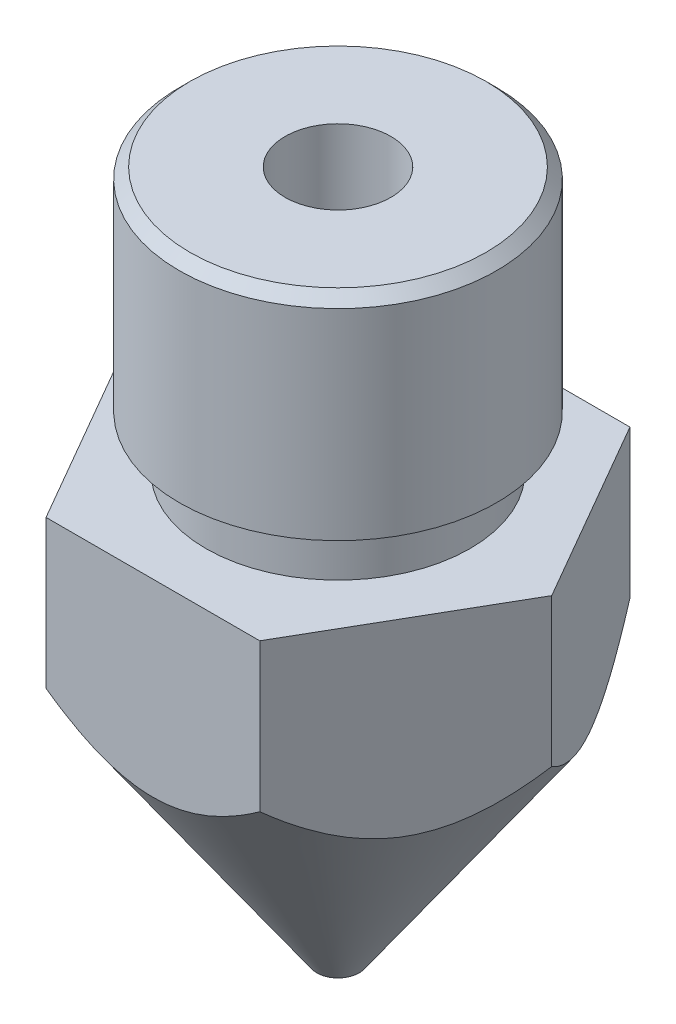
ISO-10303-21;
HEADER;
FILE_DESCRIPTION(('STEP AP214'),'2;1');
FILE_NAME('part.step','',(''),(''),'','','');
FILE_SCHEMA(('AUTOMOTIVE_DESIGN { 1 0 10303 214 1 1 1 1 }'));
ENDSEC;
DATA;
#1=APPLICATION_CONTEXT('core data for automotive mechanical design processes');
#2=APPLICATION_PROTOCOL_DEFINITION('international standard','automotive_design',2000,#1);
#3=PRODUCT_CONTEXT('',#1,'mechanical');
#4=PRODUCT('Part','Part','',(#3));
#5=PRODUCT_RELATED_PRODUCT_CATEGORY('part','',(#4));
#6=PRODUCT_DEFINITION_FORMATION('','',#4);
#7=PRODUCT_DEFINITION_CONTEXT('part definition',#1,'design');
#8=PRODUCT_DEFINITION('design','',#6,#7);
#9=PRODUCT_DEFINITION_SHAPE('','',#8);
#10=(LENGTH_UNIT() NAMED_UNIT(*) SI_UNIT(.MILLI.,.METRE.));
#11=(NAMED_UNIT(*) PLANE_ANGLE_UNIT() SI_UNIT($,.RADIAN.));
#12=(NAMED_UNIT(*) SI_UNIT($,.STERADIAN.) SOLID_ANGLE_UNIT());
#13=UNCERTAINTY_MEASURE_WITH_UNIT(LENGTH_MEASURE(1.E-05),#10,'distance_accuracy_value','');
#14=(GEOMETRIC_REPRESENTATION_CONTEXT(3) GLOBAL_UNCERTAINTY_ASSIGNED_CONTEXT((#13)) GLOBAL_UNIT_ASSIGNED_CONTEXT((#10,
#11,#12)) REPRESENTATION_CONTEXT('',''));
#15=CARTESIAN_POINT('',(0.,0.,0.));
#16=DIRECTION('',(0.,0.,1.));
#17=DIRECTION('',(1.,0.,0.));
#18=AXIS2_PLACEMENT_3D('',#15,#16,#17);
#19=CARTESIAN_POINT('',(0.,13.,0.));
#20=DIRECTION('',(0.,-1.,0.));
#21=DIRECTION('',(0.,0.,-1.));
#22=AXIS2_PLACEMENT_3D('',#19,#20,#21);
#23=CYLINDRICAL_SURFACE('',#22,0.2);
#24=CARTESIAN_POINT('',(0.,0.,0.));
#25=DIRECTION('',(0.,1.,0.));
#26=DIRECTION('',(0.,0.,1.));
#27=AXIS2_PLACEMENT_3D('',#24,#25,#26);
#28=CIRCLE('',#27,0.2);
#29=CARTESIAN_POINT('',(0.,0.,0.2));
#30=VERTEX_POINT('',#29);
#31=EDGE_CURVE('E350',#30,#30,#28,.T.);
#32=ORIENTED_EDGE('',*,*,#31,.F.);
#33=EDGE_LOOP('',(#32));
#34=FACE_BOUND('',#33,.T.);
#35=CARTESIAN_POINT('',(0.,3.,0.));
#36=DIRECTION('',(0.,1.,0.));
#37=DIRECTION('',(0.,0.,1.));
#38=AXIS2_PLACEMENT_3D('',#35,#36,#37);
#39=CIRCLE('',#38,0.2);
#40=CARTESIAN_POINT('',(0.,3.,0.2));
#41=VERTEX_POINT('',#40);
#42=EDGE_CURVE('E97',#41,#41,#39,.T.);
#43=ORIENTED_EDGE('',*,*,#42,.T.);
#44=EDGE_LOOP('',(#43));
#45=FACE_BOUND('',#44,.T.);
#46=ADVANCED_FACE('F17',(#34,#45),#23,.F.);
#47=CARTESIAN_POINT('',(0.,0.,0.));
#48=DIRECTION('',(0.,1.,0.));
#49=DIRECTION('',(0.,0.,1.));
#50=AXIS2_PLACEMENT_3D('',#47,#48,#49);
#51=PLANE('',#50);
#52=ORIENTED_EDGE('',*,*,#31,.T.);
#53=EDGE_LOOP('',(#52));
#54=FACE_BOUND('',#53,.T.);
#55=CARTESIAN_POINT('',(0.,0.,0.));
#56=DIRECTION('',(0.,1.,0.));
#57=DIRECTION('',(0.,0.,1.));
#58=AXIS2_PLACEMENT_3D('',#55,#56,#57);
#59=CIRCLE('',#58,0.4);
#60=CARTESIAN_POINT('',(0.,0.,0.4));
#61=VERTEX_POINT('',#60);
#62=EDGE_CURVE('E155',#61,#61,#59,.T.);
#63=ORIENTED_EDGE('',*,*,#62,.F.);
#64=EDGE_LOOP('',(#63));
#65=FACE_BOUND('',#64,.T.);
#66=ADVANCED_FACE('F120',(#54,#65),#51,.F.);
#67=CARTESIAN_POINT('',(0.,13.,0.));
#68=DIRECTION('',(0.,1.,0.));
#69=DIRECTION('',(0.,0.,1.));
#70=AXIS2_PLACEMENT_3D('',#67,#68,#69);
#71=PLANE('',#70);
#72=CARTESIAN_POINT('',(0.,13.,0.));
#73=DIRECTION('',(0.,1.,0.));
#74=DIRECTION('',(0.,0.,1.));
#75=AXIS2_PLACEMENT_3D('',#72,#73,#74);
#76=CIRCLE('',#75,2.8);
#77=CARTESIAN_POINT('',(0.,13.,2.8));
#78=VERTEX_POINT('',#77);
#79=EDGE_CURVE('E25',#78,#78,#76,.T.);
#80=ORIENTED_EDGE('',*,*,#79,.T.);
#81=EDGE_LOOP('',(#80));
#82=FACE_BOUND('',#81,.T.);
#83=CARTESIAN_POINT('',(0.,13.,0.));
#84=DIRECTION('',(0.,1.,0.));
#85=DIRECTION('',(0.,0.,1.));
#86=AXIS2_PLACEMENT_3D('',#83,#84,#85);
#87=CIRCLE('',#86,1.);
#88=CARTESIAN_POINT('',(0.,13.,1.));
#89=VERTEX_POINT('',#88);
#90=EDGE_CURVE('E327',#89,#89,#87,.T.);
#91=ORIENTED_EDGE('',*,*,#90,.F.);
#92=EDGE_LOOP('',(#91));
#93=FACE_BOUND('',#92,.T.);
#94=ADVANCED_FACE('F104',(#82,#93),#71,.T.);
#95=CARTESIAN_POINT('',(-2.02072594216369,13.,3.5));
#96=DIRECTION('',(0.,0.,-1.));
#97=DIRECTION('',(-1.,0.,0.));
#98=AXIS2_PLACEMENT_3D('',#95,#96,#97);
#99=PLANE('',#98);
#100=DIRECTION('',(0.,-1.,0.));
#101=VECTOR('',#100,1.);
#102=CARTESIAN_POINT('',(-2.02072594216369,13.,3.5));
#103=LINE('',#102,#101);
#104=CARTESIAN_POINT('',(-2.02072594216369,8.,3.5));
#105=VERTEX_POINT('',#104);
#106=CARTESIAN_POINT('',(-2.02072594216369,5.20053225024948,3.5));
#107=VERTEX_POINT('',#106);
#108=EDGE_CURVE('E84',#105,#107,#103,.T.);
#109=ORIENTED_EDGE('',*,*,#108,.T.);
#110=CARTESIAN_POINT('',(-6.56596910646884,10.0549633804167,3.5));
#111=CARTESIAN_POINT('',(-6.43866348835633,9.89453962518679,3.5));
#112=CARTESIAN_POINT('',(-6.31086954396274,9.73450070008599,3.5));
#113=CARTESIAN_POINT('',(-6.05409276696249,9.41536565444267,3.5));
#114=CARTESIAN_POINT('',(-5.92510987045232,9.25626958534052,3.5));
#115=CARTESIAN_POINT('',(-5.66547900136359,8.93887132675882,3.5));
#116=CARTESIAN_POINT('',(-5.53482805479293,8.78057156665934,3.5));
#117=CARTESIAN_POINT('',(-5.27186154894576,8.46536466022269,3.5));
#118=CARTESIAN_POINT('',(-5.13954602447201,8.30845748488617,3.5));
#119=CARTESIAN_POINT('',(-4.86574346116799,7.98798031222638,3.5));
#120=CARTESIAN_POINT('',(-4.72414544105982,7.82450493657504,3.5));
#121=CARTESIAN_POINT('',(-4.43819008048607,7.49998717532655,3.5));
#122=CARTESIAN_POINT('',(-4.29383281900571,7.33894472032093,3.5));
#123=CARTESIAN_POINT('',(-4.0017874337075,7.02018160230974,3.5));
#124=CARTESIAN_POINT('',(-3.85410263122494,6.86245790659457,3.5));
#125=CARTESIAN_POINT('',(-3.55432878461169,6.55126810131702,3.5));
#126=CARTESIAN_POINT('',(-3.40224034356932,6.39780141433167,3.5));
#127=CARTESIAN_POINT('',(-3.10578445457138,6.10983858775095,3.5));
#128=CARTESIAN_POINT('',(-2.96189499568121,5.97485300551214,3.5));
#129=CARTESIAN_POINT('',(-2.6677954071575,5.71161257481566,3.5));
#130=CARTESIAN_POINT('',(-2.51758001783785,5.58336353478699,3.5));
#131=CARTESIAN_POINT('',(-2.21109202426049,5.33840520958888,3.5));
#132=CARTESIAN_POINT('',(-2.05492185806982,5.22156898262048,3.5));
#133=CARTESIAN_POINT('',(-1.73270553161752,5.00258209791958,3.5));
#134=CARTESIAN_POINT('',(-1.5666795586152,4.90040279296644,3.5));
#135=CARTESIAN_POINT('',(-1.3279274138916,4.77421025496878,3.5));
#136=CARTESIAN_POINT('',(-1.26026441374337,4.74062090891803,3.5));
#137=CARTESIAN_POINT('',(-1.12293569698546,4.67739888568899,3.5));
#138=CARTESIAN_POINT('',(-1.05326564168055,4.64777570678828,3.5));
#139=CARTESIAN_POINT('',(-0.841572677756138,4.56608459440827,3.5));
#140=CARTESIAN_POINT('',(-0.696628461837466,4.52106394199791,3.5));
#141=CARTESIAN_POINT('',(-0.475301212797295,4.47205959319694,3.5));
#142=CARTESIAN_POINT('',(-0.400903000256181,4.45881411856813,3.5));
#143=CARTESIAN_POINT('',(-0.251205631776353,4.43898936574924,3.5));
#144=CARTESIAN_POINT('',(-0.175906566974466,4.4324094189001,3.5));
#145=CARTESIAN_POINT('',(-0.0246190434143277,4.42620926101708,3.5));
#146=CARTESIAN_POINT('',(0.0513709492970929,4.42662641560355,3.5));
#147=CARTESIAN_POINT('',(0.202983586239781,4.43448874857977,3.5));
#148=CARTESIAN_POINT('',(0.278606224046414,4.44193404944248,3.5));
#149=CARTESIAN_POINT('',(0.428918679303305,4.46351945444624,3.5));
#150=CARTESIAN_POINT('',(0.50360799635732,4.47766300401777,3.5));
#151=CARTESIAN_POINT('',(0.651572993314093,4.51206754550917,3.5));
#152=CARTESIAN_POINT('',(0.724848137084865,4.53233081084094,3.5));
#153=CARTESIAN_POINT('',(0.899910572260747,4.58785982680219,3.5));
#154=CARTESIAN_POINT('',(1.00083155428562,4.62585722937402,3.5));
#155=CARTESIAN_POINT('',(1.19889703425961,4.71065059278271,3.5));
#156=CARTESIAN_POINT('',(1.29603931599594,4.75745162579236,3.5));
#157=CARTESIAN_POINT('',(1.48766889879038,4.85854772483481,3.5));
#158=CARTESIAN_POINT('',(1.58211541869994,4.91291932213962,3.5));
#159=CARTESIAN_POINT('',(1.76750510936477,5.02720775539733,3.5));
#160=CARTESIAN_POINT('',(1.85844957926209,5.08712250640795,3.5));
#161=CARTESIAN_POINT('',(2.10621528063438,5.25917492957498,3.5));
#162=CARTESIAN_POINT('',(2.25979053449236,5.37597373885655,3.5));
#163=CARTESIAN_POINT('',(2.5595552007265,5.61875738389579,3.5));
#164=CARTESIAN_POINT('',(2.70573836700778,5.74474977541786,3.5));
#165=CARTESIAN_POINT('',(2.99288775316325,6.00364378251752,3.5));
#166=CARTESIAN_POINT('',(3.13383051576655,6.13657125023384,3.5));
#167=CARTESIAN_POINT('',(3.4111078237866,6.40702622585031,3.5));
#168=CARTESIAN_POINT('',(3.54744387912505,6.54455219652818,3.5));
#169=CARTESIAN_POINT('',(3.80573929247713,6.8119199283571,3.5));
#170=CARTESIAN_POINT('',(3.92797568886549,6.94149520815316,3.5));
#171=CARTESIAN_POINT('',(4.16997118326267,7.20295786967185,3.5));
#172=CARTESIAN_POINT('',(4.28973002730461,7.33484548589054,3.5));
#173=CARTESIAN_POINT('',(4.52611286600037,7.59923711362082,3.5));
#174=CARTESIAN_POINT('',(4.64275549839927,7.73172450594585,3.5));
#175=CARTESIAN_POINT('',(4.87431906433878,7.99814619089946,3.5));
#176=CARTESIAN_POINT('',(4.98924036633033,8.1320801630105,3.5));
#177=CARTESIAN_POINT('',(5.10347219829327,8.2665919853118,3.5));
#178=B_SPLINE_CURVE_WITH_KNOTS('',3,(#110,#111,#112,#113,#114,#115,#116,#117,#118,#119,#120,
#121,#122,#123,#124,#125,#126,#127,#128,#129,#130,#131,#132,#133,#134,#135,#136,#137,#138,#139,
#140,#141,#142,#143,#144,#145,#146,#147,#148,#149,#150,#151,#152,#153,#154,#155,#156,#157,#158,
#159,#160,#161,#162,#163,#164,#165,#166,#167,#168,#169,#170,#171,#172,#173,#174,#175,#176,#177),
.UNSPECIFIED.,.F.,.F.,(4,2,2,2,2,2,2,2,2,2,2,2,2,2,2,2,2,2,2,2,2,2,2,2,2,2,2,2,2,2,2,2,2,4),(0.,
0.614398243487174,1.22882970431128,1.84457683213854,2.46031110734161,3.10910690210451,
3.7578841523675,4.40604025471555,5.05410800660047,5.64584375433319,6.23808160840172,
6.82272121754572,7.40620209593753,7.63270621528486,7.85974342348608,8.31300645411389,
8.53946388358706,8.76589859350709,8.99354288350258,9.2211911405164,9.44895662213539,
9.67680682060112,9.99976924042732,10.3229183067251,10.6496100103214,10.9761793313348,
11.5544274481323,12.1331562713057,12.7142226943707,13.2950967788323,13.8294582971451,
14.3638743226156,14.893411526499,15.4228337146921),.UNSPECIFIED.);
#179=CARTESIAN_POINT('',(2.02072594216369,5.20053225024948,3.5));
#180=VERTEX_POINT('',#179);
#181=EDGE_CURVE('E32',#107,#180,#178,.T.);
#182=ORIENTED_EDGE('',*,*,#181,.T.);
#183=DIRECTION('',(0.,-1.,0.));
#184=VECTOR('',#183,1.);
#185=CARTESIAN_POINT('',(2.02072594216369,13.,3.5));
#186=LINE('',#185,#184);
#187=CARTESIAN_POINT('',(2.02072594216369,8.,3.5));
#188=VERTEX_POINT('',#187);
#189=EDGE_CURVE('E82',#188,#180,#186,.T.);
#190=ORIENTED_EDGE('',*,*,#189,.F.);
#191=DIRECTION('',(1.,0.,0.));
#192=VECTOR('',#191,1.);
#193=CARTESIAN_POINT('',(-2.02072594216369,8.,3.5));
#194=LINE('',#193,#192);
#195=EDGE_CURVE('E348',#105,#188,#194,.T.);
#196=ORIENTED_EDGE('',*,*,#195,.F.);
#197=EDGE_LOOP('',(#109,#182,#190,#196));
#198=FACE_BOUND('',#197,.T.);
#199=ADVANCED_FACE('F80',(#198),#99,.F.);
#200=CARTESIAN_POINT('',(2.02072594216369,13.,3.5));
#201=DIRECTION('',(-0.866025403784439,0.,-0.5));
#202=DIRECTION('',(-0.5,0.,0.866025403784439));
#203=AXIS2_PLACEMENT_3D('',#200,#201,#202);
#204=PLANE('',#203);
#205=ORIENTED_EDGE('',*,*,#189,.T.);
#206=CARTESIAN_POINT('',(2.02061047210985,5.20069716564401,3.5002));
#207=CARTESIAN_POINT('',(2.06406838572698,5.13868025552019,3.42492868562419));
#208=CARTESIAN_POINT('',(2.10823987084125,5.0785455200821,3.3484214291605));
#209=CARTESIAN_POINT('',(2.19834562157991,4.96311473302967,3.19235369082702));
#210=CARTESIAN_POINT('',(2.24428547173839,4.90783619410095,3.11278353626043));
#211=CARTESIAN_POINT('',(2.33895624375182,4.80253724523297,2.94880894914139));
#212=CARTESIAN_POINT('',(2.38772566583267,4.75265294242402,2.8643378322416));
#213=CARTESIAN_POINT('',(2.4871463568685,4.66142015009843,2.69213614404392));
#214=CARTESIAN_POINT('',(2.53779497704014,4.62006014719537,2.60441016057338));
#215=CARTESIAN_POINT('',(2.65984804457325,4.53479696433546,2.39300804638639));
#216=CARTESIAN_POINT('',(2.73209808660208,4.49544602753924,2.26786730274347));
#217=CARTESIAN_POINT('',(2.84180281093778,4.45535029902395,2.07785314636371));
#218=CARTESIAN_POINT('',(2.87842540048824,4.44514423835387,2.01442096055756));
#219=CARTESIAN_POINT('',(2.95198686309838,4.43126753264004,1.88700876983773));
#220=CARTESIAN_POINT('',(2.98892571455519,4.42759644473539,1.8230288023413));
#221=CARTESIAN_POINT('',(3.06291739961066,4.42696477219661,1.69487144448759));
#222=CARTESIAN_POINT('',(3.09997026868219,4.43002256499131,1.63069399268951));
#223=CARTESIAN_POINT('',(3.17379060458512,4.44274540459667,1.50283342027383));
#224=CARTESIAN_POINT('',(3.21055805134491,4.45241091189679,1.43915033442128));
#225=CARTESIAN_POINT('',(3.28389426216459,4.47806538927384,1.31212829124702));
#226=CARTESIAN_POINT('',(3.32045776133193,4.49411396352336,1.24879845298668));
#227=CARTESIAN_POINT('',(3.39284290342095,4.53192623843443,1.1234237091754));
#228=CARTESIAN_POINT('',(3.42866426335177,4.55369207743913,1.061379293779));
#229=CARTESIAN_POINT('',(3.51648921435228,4.61393890843105,0.909262016473883));
#230=CARTESIAN_POINT('',(3.5679783361557,4.65542170200923,0.820080241473256));
#231=CARTESIAN_POINT('',(3.66899632136438,4.74722764353229,0.645111958613582));
#232=CARTESIAN_POINT('',(3.718522234799,4.79756352004559,0.559330560253556));
#233=CARTESIAN_POINT('',(3.81463985277904,4.90398950830515,0.392849962409646));
#234=CARTESIAN_POINT('',(3.86127111180267,4.95993860361706,0.312082252559815));
#235=CARTESIAN_POINT('',(3.95269929229769,5.07685974888591,0.153723998698863));
#236=CARTESIAN_POINT('',(3.9975022958959,5.13781269044058,0.0761229201350578));
#237=CARTESIAN_POINT('',(4.04156735438121,5.20069716564401,-0.000200000000000459));
#238=B_SPLINE_CURVE_WITH_KNOTS('',3,(#206,#207,#208,#209,#210,#211,#212,#213,#214,#215,#216,
#217,#218,#219,#220,#221,#222,#223,#224,#225,#226,#227,#228,#229,#230,#231,#232,#233,#234,#235,
#236,#237),.UNSPECIFIED.,.F.,.F.,(4,2,2,2,2,2,2,2,2,2,2,2,2,2,2,4),(0.,0.320393122670371,
0.641897910507141,0.970209733955276,1.29807517267262,1.74525894539722,1.96687074712546,
2.18846753013118,2.41067027306681,2.63288850281819,2.85723241431995,3.08166035359645,
3.41416638316358,3.74715444245788,4.07323540634794,4.39812441959192),.UNSPECIFIED.);
#239=CARTESIAN_POINT('',(4.04145188432738,5.20053225024948,0.));
#240=VERTEX_POINT('',#239);
#241=EDGE_CURVE('E68',#180,#240,#238,.T.);
#242=ORIENTED_EDGE('',*,*,#241,.T.);
#243=DIRECTION('',(0.,-1.,0.));
#244=VECTOR('',#243,1.);
#245=CARTESIAN_POINT('',(4.04145188432738,13.,0.));
#246=LINE('',#245,#244);
#247=CARTESIAN_POINT('',(4.04145188432738,8.,0.));
#248=VERTEX_POINT('',#247);
#249=EDGE_CURVE('E90',#248,#240,#246,.T.);
#250=ORIENTED_EDGE('',*,*,#249,.F.);
#251=DIRECTION('',(0.5,0.,-0.866025403784439));
#252=VECTOR('',#251,1.);
#253=CARTESIAN_POINT('',(2.02072594216369,8.,3.5));
#254=LINE('',#253,#252);
#255=EDGE_CURVE('E88',#188,#248,#254,.T.);
#256=ORIENTED_EDGE('',*,*,#255,.F.);
#257=EDGE_LOOP('',(#205,#242,#250,#256));
#258=FACE_BOUND('',#257,.T.);
#259=ADVANCED_FACE('F87',(#258),#204,.F.);
#260=CARTESIAN_POINT('',(2.02072594216369,13.,-3.5));
#261=DIRECTION('',(-0.866025403784439,0.,0.5));
#262=DIRECTION('',(0.5,0.,0.866025403784439));
#263=AXIS2_PLACEMENT_3D('',#260,#261,#262);
#264=PLANE('',#263);
#265=ORIENTED_EDGE('',*,*,#249,.T.);
#266=CARTESIAN_POINT('',(4.04156735438121,5.20069716564401,0.0002));
#267=CARTESIAN_POINT('',(3.99810944076409,5.13868025552019,-0.0750713143758071));
#268=CARTESIAN_POINT('',(3.95393795564981,5.0785455200821,-0.151578570839502));
#269=CARTESIAN_POINT('',(3.86383220491116,4.96311473302966,-0.307646309172986));
#270=CARTESIAN_POINT('',(3.81789235475268,4.90783619410094,-0.387216463739575));
#271=CARTESIAN_POINT('',(3.72322158273924,4.80253724523297,-0.551191050858616));
#272=CARTESIAN_POINT('',(3.6744521606584,4.75265294242402,-0.635662167758408));
#273=CARTESIAN_POINT('',(3.57503146962256,4.66142015009843,-0.807863855956087));
#274=CARTESIAN_POINT('',(3.52438284945093,4.62006014719537,-0.895589839426615));
#275=CARTESIAN_POINT('',(3.40232978191782,4.53479696433545,-1.1069919536136));
#276=CARTESIAN_POINT('',(3.33007973988899,4.49544602753924,-1.23213269725653));
#277=CARTESIAN_POINT('',(3.22037501555329,4.45535029902395,-1.42214685363629));
#278=CARTESIAN_POINT('',(3.18375242600282,4.44514423835387,-1.48557903944243));
#279=CARTESIAN_POINT('',(3.11019096339269,4.43126753264004,-1.61299123016227));
#280=CARTESIAN_POINT('',(3.07325211193588,4.42759644473539,-1.6769711976587));
#281=CARTESIAN_POINT('',(2.99926042688041,4.42696477219661,-1.80512855551241));
#282=CARTESIAN_POINT('',(2.96220755780888,4.43002256499131,-1.86930600731049));
#283=CARTESIAN_POINT('',(2.88838722190595,4.44274540459667,-1.99716657972617));
#284=CARTESIAN_POINT('',(2.85161977514615,4.45241091189679,-2.06084966557872));
#285=CARTESIAN_POINT('',(2.77828356432648,4.47806538927384,-2.18787170875298));
#286=CARTESIAN_POINT('',(2.74172006515913,4.49411396352336,-2.25120154701332));
#287=CARTESIAN_POINT('',(2.66933492307011,4.53192623843443,-2.3765762908246));
#288=CARTESIAN_POINT('',(2.63351356313929,4.55369207743913,-2.438620706221));
#289=CARTESIAN_POINT('',(2.54568861213879,4.61393890843105,-2.59073798352612));
#290=CARTESIAN_POINT('',(2.49419949033537,4.65542170200923,-2.67991975852674));
#291=CARTESIAN_POINT('',(2.39318150512669,4.74722764353229,-2.85488804138642));
#292=CARTESIAN_POINT('',(2.34365559169206,4.79756352004559,-2.94066943974644));
#293=CARTESIAN_POINT('',(2.24753797371203,4.90398950830515,-3.10715003759035));
#294=CARTESIAN_POINT('',(2.2009067146884,4.95993860361706,-3.18791774744019));
#295=CARTESIAN_POINT('',(2.10947853419338,5.07685974888591,-3.34627600130114));
#296=CARTESIAN_POINT('',(2.06467553059516,5.13781269044058,-3.42387707986494));
#297=CARTESIAN_POINT('',(2.02061047210985,5.20069716564401,-3.5002));
#298=B_SPLINE_CURVE_WITH_KNOTS('',3,(#266,#267,#268,#269,#270,#271,#272,#273,#274,#275,#276,
#277,#278,#279,#280,#281,#282,#283,#284,#285,#286,#287,#288,#289,#290,#291,#292,#293,#294,#295,
#296,#297),.UNSPECIFIED.,.F.,.F.,(4,2,2,2,2,2,2,2,2,2,2,2,2,2,2,4),(0.,0.320393122670372,
0.641897910507145,0.970209733955279,1.29807517267262,1.74525894539722,1.96687074712546,
2.18846753013117,2.41067027306681,2.63288850281819,2.85723241431995,3.08166035359645,
3.41416638316358,3.74715444245788,4.07323540634794,4.39812441959192),.UNSPECIFIED.);
#299=CARTESIAN_POINT('',(2.02072594216368,5.20053225024948,-3.5));
#300=VERTEX_POINT('',#299);
#301=EDGE_CURVE('E71',#240,#300,#298,.T.);
#302=ORIENTED_EDGE('',*,*,#301,.T.);
#303=DIRECTION('',(0.,-1.,0.));
#304=VECTOR('',#303,1.);
#305=CARTESIAN_POINT('',(2.02072594216369,13.,-3.5));
#306=LINE('',#305,#304);
#307=CARTESIAN_POINT('',(2.02072594216369,8.,-3.5));
#308=VERTEX_POINT('',#307);
#309=EDGE_CURVE('E93',#308,#300,#306,.T.);
#310=ORIENTED_EDGE('',*,*,#309,.F.);
#311=DIRECTION('',(-0.5,0.,-0.866025403784439));
#312=VECTOR('',#311,1.);
#313=CARTESIAN_POINT('',(2.02072594216369,8.,-3.5));
#314=LINE('',#313,#312);
#315=EDGE_CURVE('E354',#248,#308,#314,.T.);
#316=ORIENTED_EDGE('',*,*,#315,.F.);
#317=EDGE_LOOP('',(#265,#302,#310,#316));
#318=FACE_BOUND('',#317,.T.);
#319=ADVANCED_FACE('F197',(#318),#264,.F.);
#320=CARTESIAN_POINT('',(-2.02072594216369,13.,-3.5));
#321=DIRECTION('',(0.,0.,1.));
#322=DIRECTION('',(1.,0.,0.));
#323=AXIS2_PLACEMENT_3D('',#320,#321,#322);
#324=PLANE('',#323);
#325=ORIENTED_EDGE('',*,*,#309,.T.);
#326=CARTESIAN_POINT('',(-6.56596910646884,10.0549633804167,-3.5));
#327=CARTESIAN_POINT('',(-6.43866348835633,9.89453962518678,-3.5));
#328=CARTESIAN_POINT('',(-6.31086954396274,9.73450070008599,-3.5));
#329=CARTESIAN_POINT('',(-6.05409276696249,9.41536565444267,-3.5));
#330=CARTESIAN_POINT('',(-5.92510987045231,9.25626958534052,-3.5));
#331=CARTESIAN_POINT('',(-5.66547900136359,8.93887132675882,-3.5));
#332=CARTESIAN_POINT('',(-5.53482805479292,8.78057156665933,-3.5));
#333=CARTESIAN_POINT('',(-5.27186154894576,8.46536466022269,-3.5));
#334=CARTESIAN_POINT('',(-5.139546024472,8.30845748488617,-3.5));
#335=CARTESIAN_POINT('',(-4.86574346116799,7.98798031222638,-3.5));
#336=CARTESIAN_POINT('',(-4.72414544105982,7.82450493657503,-3.5));
#337=CARTESIAN_POINT('',(-4.43819008048607,7.49998717532655,-3.5));
#338=CARTESIAN_POINT('',(-4.29383281900571,7.33894472032093,-3.5));
#339=CARTESIAN_POINT('',(-4.0017874337075,7.02018160230974,-3.5));
#340=CARTESIAN_POINT('',(-3.85410263122495,6.86245790659457,-3.5));
#341=CARTESIAN_POINT('',(-3.5543287846117,6.55126810131703,-3.5));
#342=CARTESIAN_POINT('',(-3.40224034356933,6.39780141433168,-3.5));
#343=CARTESIAN_POINT('',(-3.10578445457139,6.10983858775096,-3.5));
#344=CARTESIAN_POINT('',(-2.96189499568121,5.97485300551215,-3.5));
#345=CARTESIAN_POINT('',(-2.66779540715751,5.71161257481566,-3.5));
#346=CARTESIAN_POINT('',(-2.51758001783786,5.58336353478699,-3.5));
#347=CARTESIAN_POINT('',(-2.2110920242605,5.33840520958889,-3.5));
#348=CARTESIAN_POINT('',(-2.05492185806983,5.22156898262048,-3.5));
#349=CARTESIAN_POINT('',(-1.73270553161753,5.00258209791959,-3.5));
#350=CARTESIAN_POINT('',(-1.56667955861521,4.90040279296646,-3.5));
#351=CARTESIAN_POINT('',(-1.3279274138916,4.77421025496879,-3.5));
#352=CARTESIAN_POINT('',(-1.26026441374338,4.74062090891804,-3.5));
#353=CARTESIAN_POINT('',(-1.12293569698546,4.67739888568899,-3.5));
#354=CARTESIAN_POINT('',(-1.05326564168055,4.64777570678828,-3.5));
#355=CARTESIAN_POINT('',(-0.84157267775614,4.56608459440827,-3.5));
#356=CARTESIAN_POINT('',(-0.696628461837468,4.52106394199791,-3.5));
#357=CARTESIAN_POINT('',(-0.475301212797296,4.47205959319694,-3.5));
#358=CARTESIAN_POINT('',(-0.400903000256182,4.45881411856813,-3.5));
#359=CARTESIAN_POINT('',(-0.251205631776354,4.43898936574924,-3.5));
#360=CARTESIAN_POINT('',(-0.175906566974468,4.4324094189001,-3.5));
#361=CARTESIAN_POINT('',(-0.0246190434143289,4.42620926101708,-3.5));
#362=CARTESIAN_POINT('',(0.0513709492970916,4.42662641560355,-3.5));
#363=CARTESIAN_POINT('',(0.20298358623978,4.43448874857977,-3.5));
#364=CARTESIAN_POINT('',(0.278606224046412,4.44193404944248,-3.5));
#365=CARTESIAN_POINT('',(0.428918679303304,4.46351945444624,-3.5));
#366=CARTESIAN_POINT('',(0.503607996357319,4.47766300401777,-3.5));
#367=CARTESIAN_POINT('',(0.651572993314092,4.51206754550917,-3.5));
#368=CARTESIAN_POINT('',(0.724848137084864,4.53233081084094,-3.5));
#369=CARTESIAN_POINT('',(0.899910572260746,4.58785982680219,-3.5));
#370=CARTESIAN_POINT('',(1.00083155428562,4.62585722937402,-3.5));
#371=CARTESIAN_POINT('',(1.19889703425961,4.71065059278271,-3.5));
#372=CARTESIAN_POINT('',(1.29603931599593,4.75745162579236,-3.5));
#373=CARTESIAN_POINT('',(1.48766889879038,4.85854772483481,-3.5));
#374=CARTESIAN_POINT('',(1.58211541869994,4.91291932213962,-3.5));
#375=CARTESIAN_POINT('',(1.76750510936477,5.02720775539733,-3.5));
#376=CARTESIAN_POINT('',(1.85844957926209,5.08712250640795,-3.5));
#377=CARTESIAN_POINT('',(2.10621528063438,5.25917492957498,-3.5));
#378=CARTESIAN_POINT('',(2.25979053449236,5.37597373885655,-3.5));
#379=CARTESIAN_POINT('',(2.55955520072649,5.61875738389579,-3.5));
#380=CARTESIAN_POINT('',(2.70573836700777,5.74474977541786,-3.5));
#381=CARTESIAN_POINT('',(2.99288775316325,6.00364378251752,-3.5));
#382=CARTESIAN_POINT('',(3.13383051576655,6.13657125023384,-3.5));
#383=CARTESIAN_POINT('',(3.4111078237866,6.40702622585031,-3.5));
#384=CARTESIAN_POINT('',(3.54744387912504,6.54455219652818,-3.5));
#385=CARTESIAN_POINT('',(3.80573929247712,6.8119199283571,-3.5));
#386=CARTESIAN_POINT('',(3.92797568886549,6.94149520815316,-3.5));
#387=CARTESIAN_POINT('',(4.16997118326266,7.20295786967185,-3.5));
#388=CARTESIAN_POINT('',(4.2897300273046,7.33484548589054,-3.5));
#389=CARTESIAN_POINT('',(4.52611286600037,7.59923711362082,-3.5));
#390=CARTESIAN_POINT('',(4.64275549839927,7.73172450594585,-3.5));
#391=CARTESIAN_POINT('',(4.87431906433878,7.99814619089946,-3.5));
#392=CARTESIAN_POINT('',(4.98924036633033,8.1320801630105,-3.5));
#393=CARTESIAN_POINT('',(5.10347219829327,8.2665919853118,-3.5));
#394=B_SPLINE_CURVE_WITH_KNOTS('',3,(#326,#327,#328,#329,#330,#331,#332,#333,#334,#335,#336,
#337,#338,#339,#340,#341,#342,#343,#344,#345,#346,#347,#348,#349,#350,#351,#352,#353,#354,#355,
#356,#357,#358,#359,#360,#361,#362,#363,#364,#365,#366,#367,#368,#369,#370,#371,#372,#373,#374,
#375,#376,#377,#378,#379,#380,#381,#382,#383,#384,#385,#386,#387,#388,#389,#390,#391,#392,#393),
.UNSPECIFIED.,.F.,.F.,(4,2,2,2,2,2,2,2,2,2,2,2,2,2,2,2,2,2,2,2,2,2,2,2,2,2,2,2,2,2,2,2,2,4),(0.,
0.614398243487177,1.22882970431128,1.84457683213855,2.46031110734161,3.10910690210451,
3.75788415236749,4.40604025471554,5.05410800660046,5.64584375433318,6.23808160840171,
6.8227212175457,7.40620209593752,7.63270621528485,7.85974342348608,8.31300645411389,
8.53946388358706,8.76589859350709,8.99354288350258,9.2211911405164,9.44895662213539,
9.67680682060112,9.99976924042732,10.3229183067251,10.6496100103214,10.9761793313348,
11.5544274481323,12.1331562713057,12.7142226943707,13.2950967788323,13.8294582971451,
14.3638743226156,14.893411526499,15.4228337146921),.UNSPECIFIED.);
#395=CARTESIAN_POINT('',(-2.02072594216369,5.20053225024948,-3.5));
#396=VERTEX_POINT('',#395);
#397=EDGE_CURVE('E174',#300,#396,#394,.F.);
#398=ORIENTED_EDGE('',*,*,#397,.T.);
#399=DIRECTION('',(0.,-1.,0.));
#400=VECTOR('',#399,1.);
#401=CARTESIAN_POINT('',(-2.02072594216369,13.,-3.5));
#402=LINE('',#401,#400);
#403=CARTESIAN_POINT('',(-2.02072594216369,8.,-3.5));
#404=VERTEX_POINT('',#403);
#405=EDGE_CURVE('E362',#404,#396,#402,.T.);
#406=ORIENTED_EDGE('',*,*,#405,.F.);
#407=DIRECTION('',(-1.,0.,0.));
#408=VECTOR('',#407,1.);
#409=CARTESIAN_POINT('',(-2.02072594216369,8.,-3.5));
#410=LINE('',#409,#408);
#411=EDGE_CURVE('E369',#308,#404,#410,.T.);
#412=ORIENTED_EDGE('',*,*,#411,.F.);
#413=EDGE_LOOP('',(#325,#398,#406,#412));
#414=FACE_BOUND('',#413,.T.);
#415=ADVANCED_FACE('F222',(#414),#324,.F.);
#416=CARTESIAN_POINT('',(-4.04145188432738,13.,0.));
#417=DIRECTION('',(0.866025403784439,0.,0.5));
#418=DIRECTION('',(0.5,0.,-0.866025403784439));
#419=AXIS2_PLACEMENT_3D('',#416,#417,#418);
#420=PLANE('',#419);
#421=ORIENTED_EDGE('',*,*,#405,.T.);
#422=CARTESIAN_POINT('',(-2.02061047210985,5.20069716564401,-3.5002));
#423=CARTESIAN_POINT('',(-2.06406838572698,5.13868025552019,-3.42492868562419));
#424=CARTESIAN_POINT('',(-2.10823987084125,5.0785455200821,-3.3484214291605));
#425=CARTESIAN_POINT('',(-2.19834562157991,4.96311473302967,-3.19235369082702));
#426=CARTESIAN_POINT('',(-2.24428547173839,4.90783619410095,-3.11278353626043));
#427=CARTESIAN_POINT('',(-2.33895624375182,4.80253724523297,-2.94880894914139));
#428=CARTESIAN_POINT('',(-2.38772566583267,4.75265294242402,-2.8643378322416));
#429=CARTESIAN_POINT('',(-2.4871463568685,4.66142015009843,-2.69213614404392));
#430=CARTESIAN_POINT('',(-2.53779497704014,4.62006014719537,-2.60441016057338));
#431=CARTESIAN_POINT('',(-2.65984804457325,4.53479696433546,-2.39300804638639));
#432=CARTESIAN_POINT('',(-2.73209808660208,4.49544602753924,-2.26786730274347));
#433=CARTESIAN_POINT('',(-2.84180281093778,4.45535029902395,-2.07785314636371));
#434=CARTESIAN_POINT('',(-2.87842540048824,4.44514423835387,-2.01442096055756));
#435=CARTESIAN_POINT('',(-2.95198686309838,4.43126753264004,-1.88700876983773));
#436=CARTESIAN_POINT('',(-2.98892571455519,4.42759644473539,-1.8230288023413));
#437=CARTESIAN_POINT('',(-3.06291739961066,4.42696477219661,-1.69487144448759));
#438=CARTESIAN_POINT('',(-3.09997026868219,4.43002256499131,-1.63069399268951));
#439=CARTESIAN_POINT('',(-3.17379060458512,4.44274540459667,-1.50283342027383));
#440=CARTESIAN_POINT('',(-3.21055805134492,4.45241091189679,-1.43915033442128));
#441=CARTESIAN_POINT('',(-3.28389426216459,4.47806538927384,-1.31212829124702));
#442=CARTESIAN_POINT('',(-3.32045776133193,4.49411396352336,-1.24879845298668));
#443=CARTESIAN_POINT('',(-3.39284290342095,4.53192623843443,-1.1234237091754));
#444=CARTESIAN_POINT('',(-3.42866426335177,4.55369207743913,-1.061379293779));
#445=CARTESIAN_POINT('',(-3.51648921435228,4.61393890843105,-0.909262016473881));
#446=CARTESIAN_POINT('',(-3.5679783361557,4.65542170200923,-0.820080241473255));
#447=CARTESIAN_POINT('',(-3.66899632136438,4.74722764353229,-0.645111958613582));
#448=CARTESIAN_POINT('',(-3.718522234799,4.79756352004559,-0.559330560253556));
#449=CARTESIAN_POINT('',(-3.81463985277904,4.90398950830515,-0.392849962409645));
#450=CARTESIAN_POINT('',(-3.86127111180267,4.95993860361706,-0.312082252559814));
#451=CARTESIAN_POINT('',(-3.95269929229769,5.07685974888591,-0.153723998698862));
#452=CARTESIAN_POINT('',(-3.9975022958959,5.13781269044058,-0.0761229201350573));
#453=CARTESIAN_POINT('',(-4.04156735438121,5.20069716564401,0.000200000000000535));
#454=B_SPLINE_CURVE_WITH_KNOTS('',3,(#422,#423,#424,#425,#426,#427,#428,#429,#430,#431,#432,
#433,#434,#435,#436,#437,#438,#439,#440,#441,#442,#443,#444,#445,#446,#447,#448,#449,#450,#451,
#452,#453),.UNSPECIFIED.,.F.,.F.,(4,2,2,2,2,2,2,2,2,2,2,2,2,2,2,4),(0.,0.320393122670371,
0.641897910507142,0.970209733955276,1.29807517267262,1.74525894539722,1.96687074712546,
2.18846753013118,2.41067027306681,2.63288850281819,2.85723241431996,3.08166035359645,
3.41416638316358,3.74715444245788,4.07323540634794,4.39812441959192),.UNSPECIFIED.);
#455=CARTESIAN_POINT('',(-4.04145188432738,5.20053225024948,0.));
#456=VERTEX_POINT('',#455);
#457=EDGE_CURVE('E154',#396,#456,#454,.T.);
#458=ORIENTED_EDGE('',*,*,#457,.T.);
#459=DIRECTION('',(0.,-1.,0.));
#460=VECTOR('',#459,1.);
#461=CARTESIAN_POINT('',(-4.04145188432738,13.,0.));
#462=LINE('',#461,#460);
#463=CARTESIAN_POINT('',(-4.04145188432738,8.,0.));
#464=VERTEX_POINT('',#463);
#465=EDGE_CURVE('E359',#464,#456,#462,.T.);
#466=ORIENTED_EDGE('',*,*,#465,.F.);
#467=DIRECTION('',(-0.5,0.,0.866025403784439));
#468=VECTOR('',#467,1.);
#469=CARTESIAN_POINT('',(-4.04145188432738,8.,0.));
#470=LINE('',#469,#468);
#471=EDGE_CURVE('E40',#404,#464,#470,.T.);
#472=ORIENTED_EDGE('',*,*,#471,.F.);
#473=EDGE_LOOP('',(#421,#458,#466,#472));
#474=FACE_BOUND('',#473,.T.);
#475=ADVANCED_FACE('F141',(#474),#420,.F.);
#476=CARTESIAN_POINT('',(-4.04145188432738,13.,0.));
#477=DIRECTION('',(0.866025403784439,0.,-0.5));
#478=DIRECTION('',(-0.5,0.,-0.866025403784439));
#479=AXIS2_PLACEMENT_3D('',#476,#477,#478);
#480=PLANE('',#479);
#481=ORIENTED_EDGE('',*,*,#465,.T.);
#482=CARTESIAN_POINT('',(-4.04156735438121,5.20069716564401,-0.0002));
#483=CARTESIAN_POINT('',(-3.99810944076409,5.13868025552019,0.0750713143758075));
#484=CARTESIAN_POINT('',(-3.95393795564981,5.0785455200821,0.151578570839503));
#485=CARTESIAN_POINT('',(-3.86383220491116,4.96311473302966,0.307646309172986));
#486=CARTESIAN_POINT('',(-3.81789235475268,4.90783619410095,0.387216463739575));
#487=CARTESIAN_POINT('',(-3.72322158273924,4.80253724523297,0.551191050858616));
#488=CARTESIAN_POINT('',(-3.6744521606584,4.75265294242402,0.635662167758408));
#489=CARTESIAN_POINT('',(-3.57503146962256,4.66142015009843,0.807863855956087));
#490=CARTESIAN_POINT('',(-3.52438284945093,4.62006014719537,0.895589839426615));
#491=CARTESIAN_POINT('',(-3.40232978191782,4.53479696433545,1.1069919536136));
#492=CARTESIAN_POINT('',(-3.33007973988898,4.49544602753924,1.23213269725653));
#493=CARTESIAN_POINT('',(-3.22037501555329,4.45535029902396,1.42214685363629));
#494=CARTESIAN_POINT('',(-3.18375242600282,4.44514423835387,1.48557903944244));
#495=CARTESIAN_POINT('',(-3.11019096339269,4.43126753264004,1.61299123016227));
#496=CARTESIAN_POINT('',(-3.07325211193588,4.42759644473539,1.6769711976587));
#497=CARTESIAN_POINT('',(-2.99926042688041,4.42696477219661,1.80512855551241));
#498=CARTESIAN_POINT('',(-2.96220755780888,4.43002256499131,1.86930600731049));
#499=CARTESIAN_POINT('',(-2.88838722190595,4.44274540459667,1.99716657972617));
#500=CARTESIAN_POINT('',(-2.85161977514615,4.45241091189679,2.06084966557872));
#501=CARTESIAN_POINT('',(-2.77828356432648,4.47806538927384,2.18787170875298));
#502=CARTESIAN_POINT('',(-2.74172006515913,4.49411396352336,2.25120154701332));
#503=CARTESIAN_POINT('',(-2.66933492307011,4.53192623843443,2.3765762908246));
#504=CARTESIAN_POINT('',(-2.63351356313929,4.55369207743913,2.438620706221));
#505=CARTESIAN_POINT('',(-2.54568861213879,4.61393890843105,2.59073798352612));
#506=CARTESIAN_POINT('',(-2.49419949033537,4.65542170200923,2.67991975852674));
#507=CARTESIAN_POINT('',(-2.39318150512669,4.74722764353229,2.85488804138642));
#508=CARTESIAN_POINT('',(-2.34365559169206,4.79756352004559,2.94066943974644));
#509=CARTESIAN_POINT('',(-2.24753797371203,4.90398950830515,3.10715003759035));
#510=CARTESIAN_POINT('',(-2.2009067146884,4.95993860361706,3.18791774744019));
#511=CARTESIAN_POINT('',(-2.10947853419338,5.07685974888591,3.34627600130114));
#512=CARTESIAN_POINT('',(-2.06467553059516,5.13781269044058,3.42387707986494));
#513=CARTESIAN_POINT('',(-2.02061047210985,5.20069716564401,3.5002));
#514=B_SPLINE_CURVE_WITH_KNOTS('',3,(#482,#483,#484,#485,#486,#487,#488,#489,#490,#491,#492,
#493,#494,#495,#496,#497,#498,#499,#500,#501,#502,#503,#504,#505,#506,#507,#508,#509,#510,#511,
#512,#513),.UNSPECIFIED.,.F.,.F.,(4,2,2,2,2,2,2,2,2,2,2,2,2,2,2,4),(0.,0.320393122670371,
0.641897910507145,0.970209733955279,1.29807517267262,1.74525894539722,1.96687074712546,
2.18846753013117,2.41067027306681,2.63288850281819,2.85723241431996,3.08166035359645,
3.41416638316358,3.74715444245788,4.07323540634794,4.39812441959192),.UNSPECIFIED.);
#515=EDGE_CURVE('E146',#456,#107,#514,.T.);
#516=ORIENTED_EDGE('',*,*,#515,.T.);
#517=ORIENTED_EDGE('',*,*,#108,.F.);
#518=DIRECTION('',(0.5,0.,0.866025403784439));
#519=VECTOR('',#518,1.);
#520=CARTESIAN_POINT('',(-4.04145188432738,8.,0.));
#521=LINE('',#520,#519);
#522=EDGE_CURVE('E89',#464,#105,#521,.T.);
#523=ORIENTED_EDGE('',*,*,#522,.F.);
#524=EDGE_LOOP('',(#481,#516,#517,#523));
#525=FACE_BOUND('',#524,.T.);
#526=ADVANCED_FACE('F137',(#525),#480,.F.);
#527=CARTESIAN_POINT('',(0.,8.,0.));
#528=DIRECTION('',(0.,1.,0.));
#529=DIRECTION('',(0.,0.,1.));
#530=AXIS2_PLACEMENT_3D('',#527,#528,#529);
#531=PLANE('',#530);
#532=ORIENTED_EDGE('',*,*,#195,.T.);
#533=ORIENTED_EDGE('',*,*,#255,.T.);
#534=ORIENTED_EDGE('',*,*,#315,.T.);
#535=ORIENTED_EDGE('',*,*,#411,.T.);
#536=ORIENTED_EDGE('',*,*,#471,.T.);
#537=ORIENTED_EDGE('',*,*,#522,.T.);
#538=EDGE_LOOP('',(#532,#533,#534,#535,#536,#537));
#539=FACE_BOUND('',#538,.T.);
#540=CARTESIAN_POINT('',(0.,8.,0.));
#541=DIRECTION('',(0.,1.,0.));
#542=DIRECTION('',(0.,0.,1.));
#543=AXIS2_PLACEMENT_3D('',#540,#541,#542);
#544=CIRCLE('',#543,2.5);
#545=CARTESIAN_POINT('',(0.,8.,2.5));
#546=VERTEX_POINT('',#545);
#547=EDGE_CURVE('E99',#546,#546,#544,.T.);
#548=ORIENTED_EDGE('',*,*,#547,.F.);
#549=EDGE_LOOP('',(#548));
#550=FACE_BOUND('',#549,.T.);
#551=ADVANCED_FACE('F133',(#539,#550),#531,.T.);
#552=CARTESIAN_POINT('',(0.,8.,0.));
#553=DIRECTION('',(0.,1.,0.));
#554=DIRECTION('',(0.,0.,1.));
#555=AXIS2_PLACEMENT_3D('',#552,#553,#554);
#556=CYLINDRICAL_SURFACE('',#555,3.);
#557=CARTESIAN_POINT('',(0.,12.8,0.));
#558=DIRECTION('',(0.,1.,0.));
#559=DIRECTION('',(0.,0.,1.));
#560=AXIS2_PLACEMENT_3D('',#557,#558,#559);
#561=CIRCLE('',#560,3.);
#562=CARTESIAN_POINT('',(0.,12.8,3.));
#563=VERTEX_POINT('',#562);
#564=EDGE_CURVE('E11',#563,#563,#561,.F.);
#565=ORIENTED_EDGE('',*,*,#564,.T.);
#566=EDGE_LOOP('',(#565));
#567=FACE_BOUND('',#566,.T.);
#568=CARTESIAN_POINT('',(0.,9.,0.));
#569=DIRECTION('',(0.,1.,0.));
#570=DIRECTION('',(0.,0.,1.));
#571=AXIS2_PLACEMENT_3D('',#568,#569,#570);
#572=CIRCLE('',#571,3.);
#573=CARTESIAN_POINT('',(0.,9.,3.));
#574=VERTEX_POINT('',#573);
#575=EDGE_CURVE('E335',#574,#574,#572,.T.);
#576=ORIENTED_EDGE('',*,*,#575,.T.);
#577=EDGE_LOOP('',(#576));
#578=FACE_BOUND('',#577,.T.);
#579=ADVANCED_FACE('F166',(#567,#578),#556,.T.);
#580=CARTESIAN_POINT('',(0.,0.,0.));
#581=DIRECTION('',(0.,1.,0.));
#582=DIRECTION('',(0.,0.,1.));
#583=AXIS2_PLACEMENT_3D('',#580,#581,#582);
#584=CONICAL_SURFACE('',#583,0.4,0.610865238198013);
#585=ORIENTED_EDGE('',*,*,#62,.T.);
#586=EDGE_LOOP('',(#585));
#587=FACE_BOUND('',#586,.T.);
#588=ORIENTED_EDGE('',*,*,#515,.F.);
#589=ORIENTED_EDGE('',*,*,#457,.F.);
#590=ORIENTED_EDGE('',*,*,#397,.F.);
#591=ORIENTED_EDGE('',*,*,#301,.F.);
#592=ORIENTED_EDGE('',*,*,#241,.F.);
#593=ORIENTED_EDGE('',*,*,#181,.F.);
#594=EDGE_LOOP('',(#588,#589,#590,#591,#592,#593));
#595=FACE_BOUND('',#594,.T.);
#596=ADVANCED_FACE('F69',(#587,#595),#584,.T.);
#597=CARTESIAN_POINT('',(-3.,9.,0.));
#598=DIRECTION('',(0.,1.,0.));
#599=DIRECTION('',(0.,0.,1.));
#600=AXIS2_PLACEMENT_3D('',#597,#598,#599);
#601=PLANE('',#600);
#602=ORIENTED_EDGE('',*,*,#575,.F.);
#603=EDGE_LOOP('',(#602));
#604=FACE_BOUND('',#603,.T.);
#605=CARTESIAN_POINT('',(0.,9.,0.));
#606=DIRECTION('',(0.,1.,0.));
#607=DIRECTION('',(0.,0.,1.));
#608=AXIS2_PLACEMENT_3D('',#605,#606,#607);
#609=CIRCLE('',#608,2.5);
#610=CARTESIAN_POINT('',(0.,9.,2.5));
#611=VERTEX_POINT('',#610);
#612=EDGE_CURVE('E333',#611,#611,#609,.T.);
#613=ORIENTED_EDGE('',*,*,#612,.T.);
#614=EDGE_LOOP('',(#613));
#615=FACE_BOUND('',#614,.T.);
#616=ADVANCED_FACE('F165',(#604,#615),#601,.F.);
#617=CARTESIAN_POINT('',(0.,-0.472270219620225,0.));
#618=DIRECTION('',(0.,1.,0.));
#619=DIRECTION('',(0.,0.,1.));
#620=AXIS2_PLACEMENT_3D('',#617,#618,#619);
#621=CYLINDRICAL_SURFACE('',#620,2.5);
#622=ORIENTED_EDGE('',*,*,#612,.F.);
#623=EDGE_LOOP('',(#622));
#624=FACE_BOUND('',#623,.T.);
#625=ORIENTED_EDGE('',*,*,#547,.T.);
#626=EDGE_LOOP('',(#625));
#627=FACE_BOUND('',#626,.T.);
#628=ADVANCED_FACE('F267',(#624,#627),#621,.T.);
#629=CARTESIAN_POINT('',(0.,3.,0.));
#630=DIRECTION('',(0.,1.,0.));
#631=DIRECTION('',(0.,0.,1.));
#632=AXIS2_PLACEMENT_3D('',#629,#630,#631);
#633=CYLINDRICAL_SURFACE('',#632,1.);
#634=CARTESIAN_POINT('',(0.,3.,0.));
#635=DIRECTION('',(0.,1.,0.));
#636=DIRECTION('',(0.,0.,1.));
#637=AXIS2_PLACEMENT_3D('',#634,#635,#636);
#638=CIRCLE('',#637,1.);
#639=CARTESIAN_POINT('',(0.,3.,1.));
#640=VERTEX_POINT('',#639);
#641=EDGE_CURVE('E100',#640,#640,#638,.T.);
#642=ORIENTED_EDGE('',*,*,#641,.F.);
#643=EDGE_LOOP('',(#642));
#644=FACE_BOUND('',#643,.T.);
#645=ORIENTED_EDGE('',*,*,#90,.T.);
#646=EDGE_LOOP('',(#645));
#647=FACE_BOUND('',#646,.T.);
#648=ADVANCED_FACE('F115',(#644,#647),#633,.F.);
#649=CARTESIAN_POINT('',(0.,3.,0.));
#650=DIRECTION('',(0.,1.,0.));
#651=DIRECTION('',(0.,0.,1.));
#652=AXIS2_PLACEMENT_3D('',#649,#650,#651);
#653=PLANE('',#652);
#654=ORIENTED_EDGE('',*,*,#42,.F.);
#655=EDGE_LOOP('',(#654));
#656=FACE_BOUND('',#655,.T.);
#657=ORIENTED_EDGE('',*,*,#641,.T.);
#658=EDGE_LOOP('',(#657));
#659=FACE_BOUND('',#658,.T.);
#660=ADVANCED_FACE('F108',(#656,#659),#653,.T.);
#661=CARTESIAN_POINT('',(0.,13.,0.));
#662=DIRECTION('',(0.,-1.,0.));
#663=DIRECTION('',(0.,0.,-1.));
#664=AXIS2_PLACEMENT_3D('',#661,#662,#663);
#665=CONICAL_SURFACE('',#664,2.8,0.785398163397457);
#666=ORIENTED_EDGE('',*,*,#564,.F.);
#667=EDGE_LOOP('',(#666));
#668=FACE_BOUND('',#667,.T.);
#669=ORIENTED_EDGE('',*,*,#79,.F.);
#670=EDGE_LOOP('',(#669));
#671=FACE_BOUND('',#670,.T.);
#672=ADVANCED_FACE('F19',(#668,#671),#665,.T.);
#673=CLOSED_SHELL('',(#46,#66,#94,#199,#259,#319,#415,#475,#526,#551,#579,#596,#616,#628,#648,
#660,#672));
#674=MANIFOLD_SOLID_BREP('B1',#673);
#675=ADVANCED_BREP_SHAPE_REPRESENTATION('',(#18,#674),#14);
#676=SHAPE_DEFINITION_REPRESENTATION(#9,#675);
ENDSEC;
END-ISO-10303-21;
